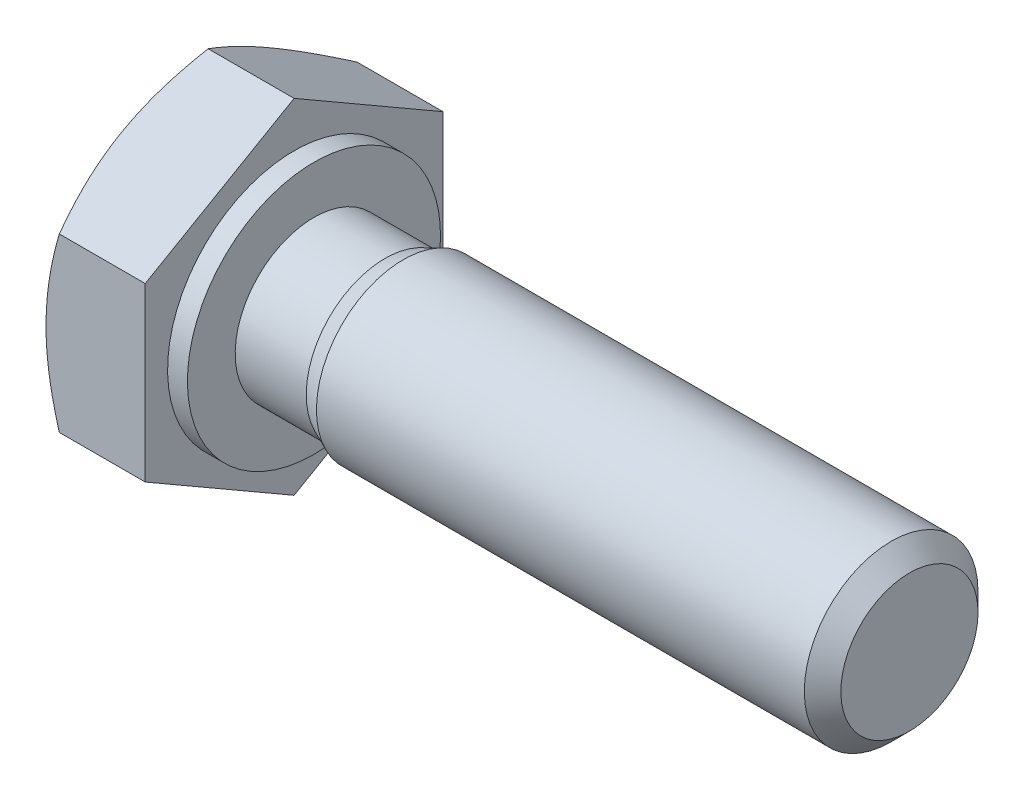
ISO-10303-21;
HEADER;
FILE_DESCRIPTION(('STEP AP214'),'2;1');
FILE_NAME('part.step','',(''),(''),'','','');
FILE_SCHEMA(('AUTOMOTIVE_DESIGN { 1 0 10303 214 1 1 1 1 }'));
ENDSEC;
DATA;
#1=APPLICATION_CONTEXT('core data for automotive mechanical design processes');
#2=APPLICATION_PROTOCOL_DEFINITION('international standard','automotive_design',2000,#1);
#3=PRODUCT_CONTEXT('',#1,'mechanical');
#4=PRODUCT('Part','Part','',(#3));
#5=PRODUCT_RELATED_PRODUCT_CATEGORY('part','',(#4));
#6=PRODUCT_DEFINITION_FORMATION('','',#4);
#7=PRODUCT_DEFINITION_CONTEXT('part definition',#1,'design');
#8=PRODUCT_DEFINITION('design','',#6,#7);
#9=PRODUCT_DEFINITION_SHAPE('','',#8);
#10=(LENGTH_UNIT() NAMED_UNIT(*) SI_UNIT(.MILLI.,.METRE.));
#11=(NAMED_UNIT(*) PLANE_ANGLE_UNIT() SI_UNIT($,.RADIAN.));
#12=(NAMED_UNIT(*) SI_UNIT($,.STERADIAN.) SOLID_ANGLE_UNIT());
#13=UNCERTAINTY_MEASURE_WITH_UNIT(LENGTH_MEASURE(1.E-05),#10,'distance_accuracy_value','');
#14=(GEOMETRIC_REPRESENTATION_CONTEXT(3) GLOBAL_UNCERTAINTY_ASSIGNED_CONTEXT((#13)) GLOBAL_UNIT_ASSIGNED_CONTEXT((#10,
#11,#12)) REPRESENTATION_CONTEXT('',''));
#15=CARTESIAN_POINT('',(0.,0.,0.));
#16=DIRECTION('',(0.,0.,1.));
#17=DIRECTION('',(1.,0.,0.));
#18=AXIS2_PLACEMENT_3D('',#15,#16,#17);
#19=CARTESIAN_POINT('',(1.615915,0.,0.));
#20=DIRECTION('',(1.,0.,0.));
#21=DIRECTION('',(0.,1.,0.));
#22=AXIS2_PLACEMENT_3D('',#19,#20,#21);
#23=CONICAL_SURFACE('',#22,1.6688101,0.415382636449067);
#24=CARTESIAN_POINT('',(1.8,0.,0.));
#25=DIRECTION('',(1.,0.,0.));
#26=DIRECTION('',(0.,1.,0.));
#27=AXIS2_PLACEMENT_3D('',#24,#25,#26);
#28=CIRCLE('',#27,1.75);
#29=CARTESIAN_POINT('',(1.8,-1.75,0.));
#30=VERTEX_POINT('',#29);
#31=EDGE_CURVE('E21',#30,#30,#28,.T.);
#32=ORIENTED_EDGE('',*,*,#31,.F.);
#33=DIRECTION('',(-0.914961978343746,0.40354005772079,0.));
#34=VECTOR('',#33,1.);
#35=CARTESIAN_POINT('',(1.615915,-1.6688101,0.));
#36=LINE('',#35,#34);
#37=CARTESIAN_POINT('',(1.43183,-1.5876202,0.));
#38=VERTEX_POINT('',#37);
#39=EDGE_CURVE('E11',#30,#38,#36,.T.);
#40=ORIENTED_EDGE('',*,*,#39,.T.);
#41=CARTESIAN_POINT('',(1.43183,0.,0.));
#42=DIRECTION('',(1.,0.,0.));
#43=DIRECTION('',(0.,1.,0.));
#44=AXIS2_PLACEMENT_3D('',#41,#42,#43);
#45=CIRCLE('',#44,1.5876202);
#46=EDGE_CURVE('E342',#38,#38,#45,.T.);
#47=ORIENTED_EDGE('',*,*,#46,.T.);
#48=ORIENTED_EDGE('',*,*,#39,.F.);
#49=EDGE_LOOP('',(#32,#40,#47,#48));
#50=FACE_BOUND('',#49,.T.);
#51=ADVANCED_FACE('F17',(#50),#23,.T.);
#52=CARTESIAN_POINT('',(0.715915,0.,0.));
#53=DIRECTION('',(1.,0.,0.));
#54=DIRECTION('',(0.,1.,0.));
#55=AXIS2_PLACEMENT_3D('',#52,#53,#54);
#56=CYLINDRICAL_SURFACE('',#55,1.5876202);
#57=ORIENTED_EDGE('',*,*,#46,.F.);
#58=DIRECTION('',(-1.,0.,0.));
#59=VECTOR('',#58,1.);
#60=CARTESIAN_POINT('',(0.715915,-1.5876202,0.));
#61=LINE('',#60,#59);
#62=CARTESIAN_POINT('',(0.,-1.5876202,0.));
#63=VERTEX_POINT('',#62);
#64=EDGE_CURVE('E28',#38,#63,#61,.T.);
#65=ORIENTED_EDGE('',*,*,#64,.T.);
#66=CARTESIAN_POINT('',(0.,0.,0.));
#67=DIRECTION('',(1.,0.,0.));
#68=DIRECTION('',(0.,1.,0.));
#69=AXIS2_PLACEMENT_3D('',#66,#67,#68);
#70=CIRCLE('',#69,1.5876202);
#71=EDGE_CURVE('E199',#63,#63,#70,.T.);
#72=ORIENTED_EDGE('',*,*,#71,.T.);
#73=ORIENTED_EDGE('',*,*,#64,.F.);
#74=EDGE_LOOP('',(#57,#65,#72,#73));
#75=FACE_BOUND('',#74,.T.);
#76=ADVANCED_FACE('F670',(#75),#56,.T.);
#77=CARTESIAN_POINT('',(0.,2.0688101,0.));
#78=DIRECTION('',(1.,0.,0.));
#79=DIRECTION('',(0.,1.,0.));
#80=AXIS2_PLACEMENT_3D('',#77,#78,#79);
#81=PLANE('',#80);
#82=ORIENTED_EDGE('',*,*,#71,.F.);
#83=EDGE_LOOP('',(#82));
#84=FACE_BOUND('',#83,.T.);
#85=CARTESIAN_POINT('',(0.,0.,0.));
#86=DIRECTION('',(1.,0.,0.));
#87=DIRECTION('',(0.,1.,0.));
#88=AXIS2_PLACEMENT_3D('',#85,#86,#87);
#89=CIRCLE('',#88,2.55);
#90=CARTESIAN_POINT('',(0.,-2.55,0.));
#91=VERTEX_POINT('',#90);
#92=EDGE_CURVE('E256',#91,#91,#89,.T.);
#93=ORIENTED_EDGE('',*,*,#92,.T.);
#94=EDGE_LOOP('',(#93));
#95=FACE_BOUND('',#94,.T.);
#96=ADVANCED_FACE('F662',(#84,#95),#81,.T.);
#97=CARTESIAN_POINT('',(-0.200049999999994,0.,0.));
#98=DIRECTION('',(1.,0.,0.));
#99=DIRECTION('',(0.,1.,0.));
#100=AXIS2_PLACEMENT_3D('',#97,#98,#99);
#101=CYLINDRICAL_SURFACE('',#100,2.55);
#102=ORIENTED_EDGE('',*,*,#92,.F.);
#103=DIRECTION('',(-1.,0.,0.));
#104=VECTOR('',#103,1.);
#105=CARTESIAN_POINT('',(-0.200049999999994,-2.55,0.));
#106=LINE('',#105,#104);
#107=CARTESIAN_POINT('',(-0.400099999999995,-2.55,0.));
#108=VERTEX_POINT('',#107);
#109=EDGE_CURVE('E254',#91,#108,#106,.T.);
#110=ORIENTED_EDGE('',*,*,#109,.T.);
#111=CARTESIAN_POINT('',(-0.400099999999994,0.,0.));
#112=DIRECTION('',(1.,0.,0.));
#113=DIRECTION('',(0.,1.,0.));
#114=AXIS2_PLACEMENT_3D('',#111,#112,#113);
#115=CIRCLE('',#114,2.55);
#116=EDGE_CURVE('E212',#108,#108,#115,.T.);
#117=ORIENTED_EDGE('',*,*,#116,.T.);
#118=ORIENTED_EDGE('',*,*,#109,.F.);
#119=EDGE_LOOP('',(#102,#110,#117,#118));
#120=FACE_BOUND('',#119,.T.);
#121=ADVANCED_FACE('F654',(#120),#101,.T.);
#122=CARTESIAN_POINT('',(-2.4001,0.,0.));
#123=DIRECTION('',(1.,0.,0.));
#124=DIRECTION('',(0.,1.,0.));
#125=AXIS2_PLACEMENT_3D('',#122,#123,#124);
#126=PLANE('',#125);
#127=CARTESIAN_POINT('',(-2.4001,0.,0.));
#128=DIRECTION('',(-1.,0.,0.));
#129=DIRECTION('',(0.,1.,0.));
#130=AXIS2_PLACEMENT_3D('',#127,#128,#129);
#131=CIRCLE('',#130,3.);
#132=CARTESIAN_POINT('',(-2.4001,0.,3.));
#133=VERTEX_POINT('',#132);
#134=CARTESIAN_POINT('',(-2.4001,2.59807621135331,1.5));
#135=VERTEX_POINT('',#134);
#136=EDGE_CURVE('E201',#133,#135,#131,.T.);
#137=ORIENTED_EDGE('',*,*,#136,.T.);
#138=CARTESIAN_POINT('',(-2.4001,0.,0.));
#139=DIRECTION('',(-1.,0.,0.));
#140=DIRECTION('',(0.,1.,0.));
#141=AXIS2_PLACEMENT_3D('',#138,#139,#140);
#142=CIRCLE('',#141,3.);
#143=CARTESIAN_POINT('',(-2.4001,2.59807621135331,-1.5));
#144=VERTEX_POINT('',#143);
#145=EDGE_CURVE('E180',#135,#144,#142,.T.);
#146=ORIENTED_EDGE('',*,*,#145,.T.);
#147=CARTESIAN_POINT('',(-2.4001,0.,0.));
#148=DIRECTION('',(-1.,0.,0.));
#149=DIRECTION('',(0.,1.,0.));
#150=AXIS2_PLACEMENT_3D('',#147,#148,#149);
#151=CIRCLE('',#150,3.);
#152=CARTESIAN_POINT('',(-2.4001,0.,-3.));
#153=VERTEX_POINT('',#152);
#154=EDGE_CURVE('E176',#144,#153,#151,.T.);
#155=ORIENTED_EDGE('',*,*,#154,.T.);
#156=CARTESIAN_POINT('',(-2.4001,0.,0.));
#157=DIRECTION('',(-1.,0.,0.));
#158=DIRECTION('',(0.,1.,0.));
#159=AXIS2_PLACEMENT_3D('',#156,#157,#158);
#160=CIRCLE('',#159,3.);
#161=CARTESIAN_POINT('',(-2.4001,-2.59807621135331,-1.5));
#162=VERTEX_POINT('',#161);
#163=EDGE_CURVE('E152',#153,#162,#160,.T.);
#164=ORIENTED_EDGE('',*,*,#163,.T.);
#165=CARTESIAN_POINT('',(-2.4001,0.,0.));
#166=DIRECTION('',(-1.,0.,0.));
#167=DIRECTION('',(0.,1.,0.));
#168=AXIS2_PLACEMENT_3D('',#165,#166,#167);
#169=CIRCLE('',#168,3.);
#170=CARTESIAN_POINT('',(-2.4001,-2.59807621135331,1.5));
#171=VERTEX_POINT('',#170);
#172=EDGE_CURVE('E97',#162,#171,#169,.T.);
#173=ORIENTED_EDGE('',*,*,#172,.T.);
#174=CARTESIAN_POINT('',(-2.4001,0.,0.));
#175=DIRECTION('',(-1.,0.,0.));
#176=DIRECTION('',(0.,1.,0.));
#177=AXIS2_PLACEMENT_3D('',#174,#175,#176);
#178=CIRCLE('',#177,3.);
#179=EDGE_CURVE('E240',#171,#133,#178,.T.);
#180=ORIENTED_EDGE('',*,*,#179,.T.);
#181=EDGE_LOOP('',(#137,#146,#155,#164,#173,#180));
#182=FACE_BOUND('',#181,.T.);
#183=ADVANCED_FACE('F178',(#182),#126,.F.);
#184=CARTESIAN_POINT('',(-0.400099999999993,-3.46410161513775,0.));
#185=DIRECTION('',(0.,-0.866025403784439,-0.5));
#186=DIRECTION('',(0.,0.5,-0.866025403784439));
#187=AXIS2_PLACEMENT_3D('',#184,#185,#186);
#188=PLANE('',#187);
#189=CARTESIAN_POINT('',(-2.4001,-2.59807621135331,-1.5));
#190=CARTESIAN_POINT('',(-2.40010000000001,-2.19615242270664,-2.19615242270662));
#191=CARTESIAN_POINT('',(-2.1321508075689,-1.73205080756889,-3.));
#192=(BOUNDED_CURVE() B_SPLINE_CURVE(2,(#189,#190,#191),.UNSPECIFIED.,.F.,
.F.) B_SPLINE_CURVE_WITH_KNOTS((3,3),(0.17571291563257,0.35142583126514),
.UNSPECIFIED.) CURVE() GEOMETRIC_REPRESENTATION_ITEM() RATIONAL_B_SPLINE_CURVE((1.,
1.03795484930203,1.)) REPRESENTATION_ITEM(''));
#193=CARTESIAN_POINT('',(-2.1321508075689,-1.73205080756889,-3.));
#194=VERTEX_POINT('',#193);
#195=EDGE_CURVE('E156',#162,#194,#192,.T.);
#196=ORIENTED_EDGE('',*,*,#195,.T.);
#197=DIRECTION('',(-1.,0.,0.));
#198=VECTOR('',#197,1.);
#199=CARTESIAN_POINT('',(-0.400099999999993,-1.73205080756887,-3.));
#200=LINE('',#199,#198);
#201=CARTESIAN_POINT('',(-0.400099999999993,-1.73205080756887,-3.));
#202=VERTEX_POINT('',#201);
#203=EDGE_CURVE('E170',#202,#194,#200,.T.);
#204=ORIENTED_EDGE('',*,*,#203,.F.);
#205=DIRECTION('',(0.,0.5,-0.866025403784439));
#206=VECTOR('',#205,1.);
#207=CARTESIAN_POINT('',(-0.400099999999993,-3.46410161513775,0.));
#208=LINE('',#207,#206);
#209=CARTESIAN_POINT('',(-0.400099999999993,-3.46410161513775,0.));
#210=VERTEX_POINT('',#209);
#211=EDGE_CURVE('E209',#210,#202,#208,.T.);
#212=ORIENTED_EDGE('',*,*,#211,.F.);
#213=DIRECTION('',(-1.,0.,0.));
#214=VECTOR('',#213,1.);
#215=CARTESIAN_POINT('',(-0.400099999999993,-3.46410161513775,0.));
#216=LINE('',#215,#214);
#217=CARTESIAN_POINT('',(-2.1321508075689,-3.46410161513774,0.));
#218=VERTEX_POINT('',#217);
#219=EDGE_CURVE('E310',#210,#218,#216,.T.);
#220=ORIENTED_EDGE('',*,*,#219,.T.);
#221=CARTESIAN_POINT('',(-2.1321508075689,-3.46410161513774,0.));
#222=CARTESIAN_POINT('',(-2.40010000000001,-2.99999999999999,-0.803847577293378));
#223=CARTESIAN_POINT('',(-2.4001,-2.59807621135331,-1.5));
#224=(BOUNDED_CURVE() B_SPLINE_CURVE(2,(#221,#222,#223),.UNSPECIFIED.,.F.,
.F.) B_SPLINE_CURVE_WITH_KNOTS((3,3),(0.,0.17571291563257),
.UNSPECIFIED.) CURVE() GEOMETRIC_REPRESENTATION_ITEM() RATIONAL_B_SPLINE_CURVE((1.,
1.03795484930203,1.)) REPRESENTATION_ITEM(''));
#225=EDGE_CURVE('E214',#218,#162,#224,.T.);
#226=ORIENTED_EDGE('',*,*,#225,.T.);
#227=EDGE_LOOP('',(#196,#204,#212,#220,#226));
#228=FACE_BOUND('',#227,.T.);
#229=ADVANCED_FACE('F638',(#228),#188,.T.);
#230=CARTESIAN_POINT('',(-0.400099999999993,-1.73205080756888,3.));
#231=DIRECTION('',(0.,-0.866025403784439,0.5));
#232=DIRECTION('',(-1.,0.,0.));
#233=AXIS2_PLACEMENT_3D('',#230,#231,#232);
#234=PLANE('',#233);
#235=CARTESIAN_POINT('',(-2.4001,-2.59807621135331,1.5));
#236=CARTESIAN_POINT('',(-2.40010000000001,-2.99999999999999,0.803847577293377));
#237=CARTESIAN_POINT('',(-2.1321508075689,-3.46410161513774,0.));
#238=(BOUNDED_CURVE() B_SPLINE_CURVE(2,(#235,#236,#237),.UNSPECIFIED.,.F.,
.F.) B_SPLINE_CURVE_WITH_KNOTS((3,3),(0.17571291563257,0.35142583126514),
.UNSPECIFIED.) CURVE() GEOMETRIC_REPRESENTATION_ITEM() RATIONAL_B_SPLINE_CURVE((1.,
1.03795484930203,1.)) REPRESENTATION_ITEM(''));
#239=EDGE_CURVE('E193',#171,#218,#238,.T.);
#240=ORIENTED_EDGE('',*,*,#239,.T.);
#241=ORIENTED_EDGE('',*,*,#219,.F.);
#242=DIRECTION('',(0.,-0.5,-0.866025403784439));
#243=VECTOR('',#242,1.);
#244=CARTESIAN_POINT('',(-0.400099999999993,-1.73205080756888,3.));
#245=LINE('',#244,#243);
#246=CARTESIAN_POINT('',(-0.400099999999993,-1.73205080756888,3.));
#247=VERTEX_POINT('',#246);
#248=EDGE_CURVE('E213',#247,#210,#245,.T.);
#249=ORIENTED_EDGE('',*,*,#248,.F.);
#250=DIRECTION('',(-1.,0.,0.));
#251=VECTOR('',#250,1.);
#252=CARTESIAN_POINT('',(-0.400099999999993,-1.73205080756888,3.));
#253=LINE('',#252,#251);
#254=CARTESIAN_POINT('',(-2.1321508075689,-1.73205080756885,3.));
#255=VERTEX_POINT('',#254);
#256=EDGE_CURVE('E110',#247,#255,#253,.T.);
#257=ORIENTED_EDGE('',*,*,#256,.T.);
#258=CARTESIAN_POINT('',(-2.1321508075689,-1.73205080756889,3.));
#259=CARTESIAN_POINT('',(-2.40010000000001,-2.19615242270664,2.19615242270662));
#260=CARTESIAN_POINT('',(-2.4001,-2.59807621135331,1.5));
#261=(BOUNDED_CURVE() B_SPLINE_CURVE(2,(#258,#259,#260),.UNSPECIFIED.,.F.,
.F.) B_SPLINE_CURVE_WITH_KNOTS((3,3),(0.,0.17571291563257),
.UNSPECIFIED.) CURVE() GEOMETRIC_REPRESENTATION_ITEM() RATIONAL_B_SPLINE_CURVE((1.,
1.03795484930203,1.)) REPRESENTATION_ITEM(''));
#262=EDGE_CURVE('E241',#255,#171,#261,.T.);
#263=ORIENTED_EDGE('',*,*,#262,.T.);
#264=EDGE_LOOP('',(#240,#241,#249,#257,#263));
#265=FACE_BOUND('',#264,.T.);
#266=ADVANCED_FACE('F630',(#265),#234,.T.);
#267=CARTESIAN_POINT('',(-0.400099999999994,1.73205080756887,3.));
#268=DIRECTION('',(0.,0.,1.));
#269=DIRECTION('',(0.,-1.,0.));
#270=AXIS2_PLACEMENT_3D('',#267,#268,#269);
#271=PLANE('',#270);
#272=CARTESIAN_POINT('',(-2.4001,0.,3.));
#273=CARTESIAN_POINT('',(-2.40010000000001,-0.803847577293359,3.));
#274=CARTESIAN_POINT('',(-2.1321508075689,-1.73205080756885,3.));
#275=(BOUNDED_CURVE() B_SPLINE_CURVE(2,(#272,#273,#274),.UNSPECIFIED.,.F.,
.F.) B_SPLINE_CURVE_WITH_KNOTS((3,3),(0.17571291563257,0.35142583126514),
.UNSPECIFIED.) CURVE() GEOMETRIC_REPRESENTATION_ITEM() RATIONAL_B_SPLINE_CURVE((1.,
1.03795484930204,1.)) REPRESENTATION_ITEM(''));
#276=EDGE_CURVE('E232',#133,#255,#275,.T.);
#277=ORIENTED_EDGE('',*,*,#276,.T.);
#278=ORIENTED_EDGE('',*,*,#256,.F.);
#279=DIRECTION('',(0.,-1.,0.));
#280=VECTOR('',#279,1.);
#281=CARTESIAN_POINT('',(-0.400099999999994,1.73205080756887,3.));
#282=LINE('',#281,#280);
#283=CARTESIAN_POINT('',(-0.400099999999994,1.73205080756887,3.));
#284=VERTEX_POINT('',#283);
#285=EDGE_CURVE('E136',#284,#247,#282,.T.);
#286=ORIENTED_EDGE('',*,*,#285,.F.);
#287=DIRECTION('',(-1.,0.,0.));
#288=VECTOR('',#287,1.);
#289=CARTESIAN_POINT('',(-0.400099999999994,1.73205080756887,3.));
#290=LINE('',#289,#288);
#291=CARTESIAN_POINT('',(-2.1321508075689,1.73205080756884,3.));
#292=VERTEX_POINT('',#291);
#293=EDGE_CURVE('E249',#284,#292,#290,.T.);
#294=ORIENTED_EDGE('',*,*,#293,.T.);
#295=CARTESIAN_POINT('',(-2.1321508075689,1.73205080756884,3.));
#296=CARTESIAN_POINT('',(-2.40010000000001,0.803847577293353,3.));
#297=CARTESIAN_POINT('',(-2.4001,0.,3.));
#298=(BOUNDED_CURVE() B_SPLINE_CURVE(2,(#295,#296,#297),.UNSPECIFIED.,.F.,
.F.) B_SPLINE_CURVE_WITH_KNOTS((3,3),(0.,0.17571291563257),
.UNSPECIFIED.) CURVE() GEOMETRIC_REPRESENTATION_ITEM() RATIONAL_B_SPLINE_CURVE((1.,
1.03795484930205,1.)) REPRESENTATION_ITEM(''));
#299=EDGE_CURVE('E207',#292,#133,#298,.T.);
#300=ORIENTED_EDGE('',*,*,#299,.T.);
#301=EDGE_LOOP('',(#277,#278,#286,#294,#300));
#302=FACE_BOUND('',#301,.T.);
#303=ADVANCED_FACE('F621',(#302),#271,.T.);
#304=CARTESIAN_POINT('',(-0.400099999999993,0.,0.));
#305=DIRECTION('',(1.,0.,0.));
#306=DIRECTION('',(0.,1.,0.));
#307=AXIS2_PLACEMENT_3D('',#304,#305,#306);
#308=PLANE('',#307);
#309=ORIENTED_EDGE('',*,*,#116,.F.);
#310=EDGE_LOOP('',(#309));
#311=FACE_BOUND('',#310,.T.);
#312=DIRECTION('',(0.,-0.5,0.866025403784438));
#313=VECTOR('',#312,1.);
#314=CARTESIAN_POINT('',(-0.400099999999994,3.46410161513775,0.));
#315=LINE('',#314,#313);
#316=CARTESIAN_POINT('',(-0.400099999999994,3.46410161513775,0.));
#317=VERTEX_POINT('',#316);
#318=EDGE_CURVE('E253',#317,#284,#315,.T.);
#319=ORIENTED_EDGE('',*,*,#318,.T.);
#320=ORIENTED_EDGE('',*,*,#285,.T.);
#321=ORIENTED_EDGE('',*,*,#248,.T.);
#322=ORIENTED_EDGE('',*,*,#211,.T.);
#323=DIRECTION('',(0.,1.,0.));
#324=VECTOR('',#323,1.);
#325=CARTESIAN_POINT('',(-0.400099999999993,-1.73205080756887,-3.));
#326=LINE('',#325,#324);
#327=CARTESIAN_POINT('',(-0.400099999999994,1.73205080756888,-3.));
#328=VERTEX_POINT('',#327);
#329=EDGE_CURVE('E279',#202,#328,#326,.T.);
#330=ORIENTED_EDGE('',*,*,#329,.T.);
#331=DIRECTION('',(0.,0.5,0.866025403784439));
#332=VECTOR('',#331,1.);
#333=CARTESIAN_POINT('',(-0.400099999999994,1.73205080756888,-3.));
#334=LINE('',#333,#332);
#335=EDGE_CURVE('E242',#328,#317,#334,.T.);
#336=ORIENTED_EDGE('',*,*,#335,.T.);
#337=EDGE_LOOP('',(#319,#320,#321,#322,#330,#336));
#338=FACE_BOUND('',#337,.T.);
#339=ADVANCED_FACE('F610',(#311,#338),#308,.T.);
#340=CARTESIAN_POINT('',(-0.400099999999994,3.46410161513775,0.));
#341=DIRECTION('',(0.,0.866025403784438,0.5));
#342=DIRECTION('',(1.,0.,0.));
#343=AXIS2_PLACEMENT_3D('',#340,#341,#342);
#344=PLANE('',#343);
#345=CARTESIAN_POINT('',(-2.1321508075689,3.46410161513774,0.));
#346=CARTESIAN_POINT('',(-2.40010000000001,2.99999999999999,0.803847577293379));
#347=CARTESIAN_POINT('',(-2.4001,2.59807621135331,1.5));
#348=(BOUNDED_CURVE() B_SPLINE_CURVE(2,(#345,#346,#347),.UNSPECIFIED.,.F.,
.F.) B_SPLINE_CURVE_WITH_KNOTS((3,3),(0.,0.17571291563257),
.UNSPECIFIED.) CURVE() GEOMETRIC_REPRESENTATION_ITEM() RATIONAL_B_SPLINE_CURVE((1.,
1.03795484930203,1.)) REPRESENTATION_ITEM(''));
#349=CARTESIAN_POINT('',(-2.1321508075689,3.46410161513774,0.));
#350=VERTEX_POINT('',#349);
#351=EDGE_CURVE('E220',#350,#135,#348,.T.);
#352=ORIENTED_EDGE('',*,*,#351,.T.);
#353=CARTESIAN_POINT('',(-2.4001,2.59807621135331,1.5));
#354=CARTESIAN_POINT('',(-2.40010000000001,2.19615242270663,2.19615242270662));
#355=CARTESIAN_POINT('',(-2.1321508075689,1.73205080756889,3.));
#356=(BOUNDED_CURVE() B_SPLINE_CURVE(2,(#353,#354,#355),.UNSPECIFIED.,.F.,
.F.) B_SPLINE_CURVE_WITH_KNOTS((3,3),(0.17571291563257,0.35142583126514),
.UNSPECIFIED.) CURVE() GEOMETRIC_REPRESENTATION_ITEM() RATIONAL_B_SPLINE_CURVE((1.,
1.03795484930204,1.)) REPRESENTATION_ITEM(''));
#357=EDGE_CURVE('E208',#135,#292,#356,.T.);
#358=ORIENTED_EDGE('',*,*,#357,.T.);
#359=ORIENTED_EDGE('',*,*,#293,.F.);
#360=ORIENTED_EDGE('',*,*,#318,.F.);
#361=DIRECTION('',(-1.,0.,0.));
#362=VECTOR('',#361,1.);
#363=CARTESIAN_POINT('',(-0.400099999999994,3.46410161513775,0.));
#364=LINE('',#363,#362);
#365=EDGE_CURVE('E250',#317,#350,#364,.T.);
#366=ORIENTED_EDGE('',*,*,#365,.T.);
#367=EDGE_LOOP('',(#352,#358,#359,#360,#366));
#368=FACE_BOUND('',#367,.T.);
#369=ADVANCED_FACE('F599',(#368),#344,.T.);
#370=CARTESIAN_POINT('',(-0.400099999999994,1.73205080756888,-3.));
#371=DIRECTION('',(0.,0.866025403784439,-0.5));
#372=DIRECTION('',(-1.,0.,0.));
#373=AXIS2_PLACEMENT_3D('',#370,#371,#372);
#374=PLANE('',#373);
#375=CARTESIAN_POINT('',(-2.1321508075689,1.73205080756889,-3.));
#376=CARTESIAN_POINT('',(-2.40010000000001,2.19615242270664,-2.19615242270662));
#377=CARTESIAN_POINT('',(-2.4001,2.59807621135331,-1.5));
#378=(BOUNDED_CURVE() B_SPLINE_CURVE(2,(#375,#376,#377),.UNSPECIFIED.,.F.,
.F.) B_SPLINE_CURVE_WITH_KNOTS((3,3),(0.,0.17571291563257),
.UNSPECIFIED.) CURVE() GEOMETRIC_REPRESENTATION_ITEM() RATIONAL_B_SPLINE_CURVE((1.,
1.03795484930204,1.)) REPRESENTATION_ITEM(''));
#379=CARTESIAN_POINT('',(-2.1321508075689,1.73205080756885,-3.));
#380=VERTEX_POINT('',#379);
#381=EDGE_CURVE('E172',#380,#144,#378,.T.);
#382=ORIENTED_EDGE('',*,*,#381,.T.);
#383=CARTESIAN_POINT('',(-2.4001,2.59807621135331,-1.5));
#384=CARTESIAN_POINT('',(-2.40010000000001,2.99999999999999,-0.803847577293378));
#385=CARTESIAN_POINT('',(-2.1321508075689,3.46410161513774,0.));
#386=(BOUNDED_CURVE() B_SPLINE_CURVE(2,(#383,#384,#385),.UNSPECIFIED.,.F.,
.F.) B_SPLINE_CURVE_WITH_KNOTS((3,3),(0.17571291563257,0.35142583126514),
.UNSPECIFIED.) CURVE() GEOMETRIC_REPRESENTATION_ITEM() RATIONAL_B_SPLINE_CURVE((1.,
1.03795484930204,1.)) REPRESENTATION_ITEM(''));
#387=EDGE_CURVE('E312',#144,#350,#386,.T.);
#388=ORIENTED_EDGE('',*,*,#387,.T.);
#389=ORIENTED_EDGE('',*,*,#365,.F.);
#390=ORIENTED_EDGE('',*,*,#335,.F.);
#391=DIRECTION('',(-1.,0.,0.));
#392=VECTOR('',#391,1.);
#393=CARTESIAN_POINT('',(-0.400099999999994,1.73205080756888,-3.));
#394=LINE('',#393,#392);
#395=EDGE_CURVE('E159',#328,#380,#394,.T.);
#396=ORIENTED_EDGE('',*,*,#395,.T.);
#397=EDGE_LOOP('',(#382,#388,#389,#390,#396));
#398=FACE_BOUND('',#397,.T.);
#399=ADVANCED_FACE('F591',(#398),#374,.T.);
#400=CARTESIAN_POINT('',(-0.400099999999993,-1.73205080756887,-3.));
#401=DIRECTION('',(0.,0.,-1.));
#402=DIRECTION('',(-1.,0.,0.));
#403=AXIS2_PLACEMENT_3D('',#400,#401,#402);
#404=PLANE('',#403);
#405=CARTESIAN_POINT('',(-2.1321508075689,-1.73205080756885,-3.));
#406=CARTESIAN_POINT('',(-2.40010000000001,-0.803847577293356,-3.));
#407=CARTESIAN_POINT('',(-2.4001,0.,-3.));
#408=(BOUNDED_CURVE() B_SPLINE_CURVE(2,(#405,#406,#407),.UNSPECIFIED.,.F.,
.F.) B_SPLINE_CURVE_WITH_KNOTS((3,3),(0.,0.17571291563257),
.UNSPECIFIED.) CURVE() GEOMETRIC_REPRESENTATION_ITEM() RATIONAL_B_SPLINE_CURVE((1.,
1.03795484930204,1.)) REPRESENTATION_ITEM(''));
#409=EDGE_CURVE('E154',#194,#153,#408,.T.);
#410=ORIENTED_EDGE('',*,*,#409,.T.);
#411=CARTESIAN_POINT('',(-2.4001,0.,-3.));
#412=CARTESIAN_POINT('',(-2.40010000000001,0.803847577293357,-3.));
#413=CARTESIAN_POINT('',(-2.1321508075689,1.73205080756885,-3.));
#414=(BOUNDED_CURVE() B_SPLINE_CURVE(2,(#411,#412,#413),.UNSPECIFIED.,.F.,
.F.) B_SPLINE_CURVE_WITH_KNOTS((3,3),(0.17571291563257,0.35142583126514),
.UNSPECIFIED.) CURVE() GEOMETRIC_REPRESENTATION_ITEM() RATIONAL_B_SPLINE_CURVE((1.,
1.03795484930205,1.)) REPRESENTATION_ITEM(''));
#415=EDGE_CURVE('E167',#153,#380,#414,.T.);
#416=ORIENTED_EDGE('',*,*,#415,.T.);
#417=ORIENTED_EDGE('',*,*,#395,.F.);
#418=ORIENTED_EDGE('',*,*,#329,.F.);
#419=ORIENTED_EDGE('',*,*,#203,.T.);
#420=EDGE_LOOP('',(#410,#416,#417,#418,#419));
#421=FACE_BOUND('',#420,.T.);
#422=ADVANCED_FACE('F164',(#421),#404,.T.);
#423=CARTESIAN_POINT('',(-2.26612540378445,0.,0.));
#424=DIRECTION('',(1.,0.,0.));
#425=DIRECTION('',(0.,1.,0.));
#426=AXIS2_PLACEMENT_3D('',#423,#424,#425);
#427=CONICAL_SURFACE('',#426,3.23205080756887,1.0471975511966);
#428=ORIENTED_EDGE('',*,*,#409,.F.);
#429=ORIENTED_EDGE('',*,*,#195,.F.);
#430=ORIENTED_EDGE('',*,*,#163,.F.);
#431=EDGE_LOOP('',(#428,#429,#430));
#432=FACE_BOUND('',#431,.T.);
#433=ADVANCED_FACE('F19',(#432),#427,.T.);
#434=CARTESIAN_POINT('',(-2.26612540378445,0.,0.));
#435=DIRECTION('',(1.,0.,0.));
#436=DIRECTION('',(0.,1.,0.));
#437=AXIS2_PLACEMENT_3D('',#434,#435,#436);
#438=CONICAL_SURFACE('',#437,3.23205080756887,1.0471975511966);
#439=ORIENTED_EDGE('',*,*,#415,.F.);
#440=ORIENTED_EDGE('',*,*,#154,.F.);
#441=ORIENTED_EDGE('',*,*,#381,.F.);
#442=EDGE_LOOP('',(#439,#440,#441));
#443=FACE_BOUND('',#442,.T.);
#444=ADVANCED_FACE('F186',(#443),#438,.T.);
#445=CARTESIAN_POINT('',(-2.26612540378445,0.,0.));
#446=DIRECTION('',(1.,0.,0.));
#447=DIRECTION('',(0.,-1.,0.));
#448=AXIS2_PLACEMENT_3D('',#445,#446,#447);
#449=CONICAL_SURFACE('',#448,3.23205080756887,1.0471975511966);
#450=ORIENTED_EDGE('',*,*,#225,.F.);
#451=ORIENTED_EDGE('',*,*,#239,.F.);
#452=ORIENTED_EDGE('',*,*,#172,.F.);
#453=EDGE_LOOP('',(#450,#451,#452));
#454=FACE_BOUND('',#453,.T.);
#455=ADVANCED_FACE('F555',(#454),#449,.T.);
#456=CARTESIAN_POINT('',(-2.26612540378445,0.,0.));
#457=DIRECTION('',(1.,0.,0.));
#458=DIRECTION('',(0.,1.,0.));
#459=AXIS2_PLACEMENT_3D('',#456,#457,#458);
#460=CONICAL_SURFACE('',#459,3.23205080756887,1.0471975511966);
#461=ORIENTED_EDGE('',*,*,#387,.F.);
#462=ORIENTED_EDGE('',*,*,#145,.F.);
#463=ORIENTED_EDGE('',*,*,#351,.F.);
#464=EDGE_LOOP('',(#461,#462,#463));
#465=FACE_BOUND('',#464,.T.);
#466=ADVANCED_FACE('F545',(#465),#460,.T.);
#467=CARTESIAN_POINT('',(-2.26612540378445,0.,0.));
#468=DIRECTION('',(1.,0.,0.));
#469=DIRECTION('',(0.,1.,0.));
#470=AXIS2_PLACEMENT_3D('',#467,#468,#469);
#471=CONICAL_SURFACE('',#470,3.23205080756887,1.0471975511966);
#472=ORIENTED_EDGE('',*,*,#262,.F.);
#473=ORIENTED_EDGE('',*,*,#276,.F.);
#474=ORIENTED_EDGE('',*,*,#179,.F.);
#475=EDGE_LOOP('',(#472,#473,#474));
#476=FACE_BOUND('',#475,.T.);
#477=ADVANCED_FACE('F535',(#476),#471,.T.);
#478=CARTESIAN_POINT('',(-2.26612540378445,0.,0.));
#479=DIRECTION('',(1.,0.,0.));
#480=DIRECTION('',(0.,1.,0.));
#481=AXIS2_PLACEMENT_3D('',#478,#479,#480);
#482=CONICAL_SURFACE('',#481,3.23205080756887,1.0471975511966);
#483=ORIENTED_EDGE('',*,*,#357,.F.);
#484=ORIENTED_EDGE('',*,*,#136,.F.);
#485=ORIENTED_EDGE('',*,*,#299,.F.);
#486=EDGE_LOOP('',(#483,#484,#485));
#487=FACE_BOUND('',#486,.T.);
#488=ADVANCED_FACE('F523',(#487),#482,.T.);
#489=CARTESIAN_POINT('',(12.,0.875,0.));
#490=DIRECTION('',(1.,0.,0.));
#491=DIRECTION('',(0.,1.,0.));
#492=AXIS2_PLACEMENT_3D('',#489,#490,#491);
#493=PLANE('',#492);
#494=CARTESIAN_POINT('',(12.,0.,0.));
#495=DIRECTION('',(-1.,0.,0.));
#496=DIRECTION('',(0.,-1.,0.));
#497=AXIS2_PLACEMENT_3D('',#494,#495,#496);
#498=CIRCLE('',#497,1.38193);
#499=CARTESIAN_POINT('',(12.,1.38193,0.));
#500=VERTEX_POINT('',#499);
#501=EDGE_CURVE('E267',#500,#500,#498,.T.);
#502=ORIENTED_EDGE('',*,*,#501,.F.);
#503=EDGE_LOOP('',(#502));
#504=FACE_BOUND('',#503,.T.);
#505=ADVANCED_FACE('F512',(#504),#493,.T.);
#506=CARTESIAN_POINT('',(6.9,0.,0.));
#507=DIRECTION('',(1.,0.,0.));
#508=DIRECTION('',(0.,1.,0.));
#509=AXIS2_PLACEMENT_3D('',#506,#507,#508);
#510=CYLINDRICAL_SURFACE('',#509,1.75);
#511=CARTESIAN_POINT('',(11.63183,0.,0.));
#512=DIRECTION('',(1.,0.,0.));
#513=DIRECTION('',(0.,-1.,0.));
#514=AXIS2_PLACEMENT_3D('',#511,#512,#513);
#515=CIRCLE('',#514,1.75);
#516=CARTESIAN_POINT('',(11.63183,1.75,0.));
#517=VERTEX_POINT('',#516);
#518=CARTESIAN_POINT('',(11.63183,-1.75,0.));
#519=VERTEX_POINT('',#518);
#520=EDGE_CURVE('E343',#517,#519,#515,.T.);
#521=ORIENTED_EDGE('',*,*,#520,.F.);
#522=CARTESIAN_POINT('',(11.63183,0.,0.));
#523=DIRECTION('',(1.,0.,0.));
#524=DIRECTION('',(0.,-1.,0.));
#525=AXIS2_PLACEMENT_3D('',#522,#523,#524);
#526=CIRCLE('',#525,1.75);
#527=EDGE_CURVE('E331',#519,#517,#526,.T.);
#528=ORIENTED_EDGE('',*,*,#527,.F.);
#529=DIRECTION('',(-1.,0.,0.));
#530=VECTOR('',#529,1.);
#531=CARTESIAN_POINT('',(6.9,-1.75,0.));
#532=LINE('',#531,#530);
#533=EDGE_CURVE('E327',#519,#30,#532,.T.);
#534=ORIENTED_EDGE('',*,*,#533,.T.);
#535=ORIENTED_EDGE('',*,*,#31,.T.);
#536=ORIENTED_EDGE('',*,*,#533,.F.);
#537=EDGE_LOOP('',(#521,#528,#534,#535,#536));
#538=FACE_BOUND('',#537,.T.);
#539=ADVANCED_FACE('F376',(#538),#510,.T.);
#540=CARTESIAN_POINT('',(11.815915,0.,0.));
#541=DIRECTION('',(-1.,0.,0.));
#542=DIRECTION('',(0.,-1.,0.));
#543=AXIS2_PLACEMENT_3D('',#540,#541,#542);
#544=CONICAL_SURFACE('',#543,1.565965,0.785262338123912);
#545=ORIENTED_EDGE('',*,*,#501,.T.);
#546=DIRECTION('',(-0.707202817635695,0.707010731692337,0.));
#547=VECTOR('',#546,1.);
#548=CARTESIAN_POINT('',(11.815915,1.565965,0.));
#549=LINE('',#548,#547);
#550=EDGE_CURVE('E274',#500,#517,#549,.T.);
#551=ORIENTED_EDGE('',*,*,#550,.T.);
#552=ORIENTED_EDGE('',*,*,#520,.T.);
#553=ORIENTED_EDGE('',*,*,#527,.T.);
#554=ORIENTED_EDGE('',*,*,#550,.F.);
#555=EDGE_LOOP('',(#545,#551,#552,#553,#554));
#556=FACE_BOUND('',#555,.T.);
#557=ADVANCED_FACE('F366',(#556),#544,.T.);
#558=CLOSED_SHELL('',(#51,#76,#96,#121,#183,#229,#266,#303,#339,#369,#399,#422,#433,#444,#455,
#466,#477,#488,#505,#539,#557));
#559=MANIFOLD_SOLID_BREP('B1',#558);
#560=ADVANCED_BREP_SHAPE_REPRESENTATION('',(#18,#559),#14);
#561=SHAPE_DEFINITION_REPRESENTATION(#9,#560);
ENDSEC;
END-ISO-10303-21;
